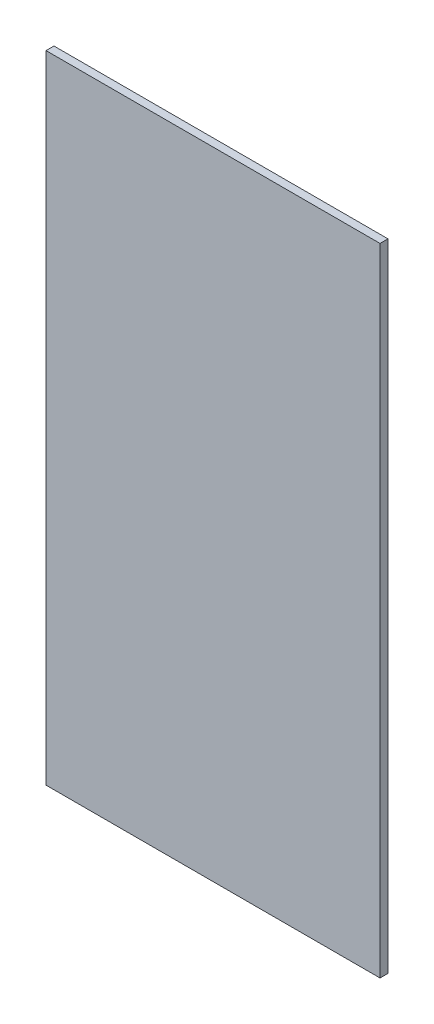
ISO-10303-21;
HEADER;
FILE_DESCRIPTION(('STEP AP214'),'2;1');
FILE_NAME('part.step','',(''),(''),'','','');
FILE_SCHEMA(('AUTOMOTIVE_DESIGN { 1 0 10303 214 1 1 1 1 }'));
ENDSEC;
DATA;
#1=APPLICATION_CONTEXT('core data for automotive mechanical design processes');
#2=APPLICATION_PROTOCOL_DEFINITION('international standard','automotive_design',2000,#1);
#3=PRODUCT_CONTEXT('',#1,'mechanical');
#4=PRODUCT('Part','Part','',(#3));
#5=PRODUCT_RELATED_PRODUCT_CATEGORY('part','',(#4));
#6=PRODUCT_DEFINITION_FORMATION('','',#4);
#7=PRODUCT_DEFINITION_CONTEXT('part definition',#1,'design');
#8=PRODUCT_DEFINITION('design','',#6,#7);
#9=PRODUCT_DEFINITION_SHAPE('','',#8);
#10=(LENGTH_UNIT() NAMED_UNIT(*) SI_UNIT(.MILLI.,.METRE.));
#11=(NAMED_UNIT(*) PLANE_ANGLE_UNIT() SI_UNIT($,.RADIAN.));
#12=(NAMED_UNIT(*) SI_UNIT($,.STERADIAN.) SOLID_ANGLE_UNIT());
#13=UNCERTAINTY_MEASURE_WITH_UNIT(LENGTH_MEASURE(1.E-05),#10,'distance_accuracy_value','');
#14=(GEOMETRIC_REPRESENTATION_CONTEXT(3) GLOBAL_UNCERTAINTY_ASSIGNED_CONTEXT((#13)) GLOBAL_UNIT_ASSIGNED_CONTEXT((#10,
#11,#12)) REPRESENTATION_CONTEXT('',''));
#15=CARTESIAN_POINT('',(0.,0.,0.));
#16=DIRECTION('',(0.,0.,1.));
#17=DIRECTION('',(1.,0.,0.));
#18=AXIS2_PLACEMENT_3D('',#15,#16,#17);
#19=CARTESIAN_POINT('',(1575.,3000.,75.));
#20=DIRECTION('',(-1.,0.,0.));
#21=DIRECTION('',(0.,-1.,0.));
#22=AXIS2_PLACEMENT_3D('',#19,#20,#21);
#23=PLANE('',#22);
#24=DIRECTION('',(0.,1.,0.));
#25=VECTOR('',#24,1.);
#26=CARTESIAN_POINT('',(1575.,3000.,0.));
#27=LINE('',#26,#25);
#28=CARTESIAN_POINT('',(1575.,-3000.,0.));
#29=VERTEX_POINT('',#28);
#30=CARTESIAN_POINT('',(1575.,3000.,0.));
#31=VERTEX_POINT('',#30);
#32=EDGE_CURVE('E115',#29,#31,#27,.T.);
#33=ORIENTED_EDGE('',*,*,#32,.T.);
#34=DIRECTION('',(0.,0.,-1.));
#35=VECTOR('',#34,1.);
#36=CARTESIAN_POINT('',(1575.,3000.,75.));
#37=LINE('',#36,#35);
#38=CARTESIAN_POINT('',(1575.,3000.,75.));
#39=VERTEX_POINT('',#38);
#40=EDGE_CURVE('E11',#39,#31,#37,.T.);
#41=ORIENTED_EDGE('',*,*,#40,.F.);
#42=DIRECTION('',(0.,1.,0.));
#43=VECTOR('',#42,1.);
#44=CARTESIAN_POINT('',(1575.,3000.,75.));
#45=LINE('',#44,#43);
#46=CARTESIAN_POINT('',(1575.,-3000.,75.));
#47=VERTEX_POINT('',#46);
#48=EDGE_CURVE('E99',#47,#39,#45,.T.);
#49=ORIENTED_EDGE('',*,*,#48,.F.);
#50=DIRECTION('',(0.,0.,-1.));
#51=VECTOR('',#50,1.);
#52=CARTESIAN_POINT('',(1575.,-3000.,75.));
#53=LINE('',#52,#51);
#54=EDGE_CURVE('E111',#47,#29,#53,.T.);
#55=ORIENTED_EDGE('',*,*,#54,.T.);
#56=EDGE_LOOP('',(#33,#41,#49,#55));
#57=FACE_BOUND('',#56,.T.);
#58=ADVANCED_FACE('F47',(#57),#23,.F.);
#59=CARTESIAN_POINT('',(-1575.,3000.,75.));
#60=DIRECTION('',(0.,-1.,0.));
#61=DIRECTION('',(0.,0.,-1.));
#62=AXIS2_PLACEMENT_3D('',#59,#60,#61);
#63=PLANE('',#62);
#64=DIRECTION('',(-1.,0.,0.));
#65=VECTOR('',#64,1.);
#66=CARTESIAN_POINT('',(-1575.,3000.,0.));
#67=LINE('',#66,#65);
#68=CARTESIAN_POINT('',(-1575.,3000.,0.));
#69=VERTEX_POINT('',#68);
#70=EDGE_CURVE('E104',#31,#69,#67,.T.);
#71=ORIENTED_EDGE('',*,*,#70,.T.);
#72=DIRECTION('',(0.,0.,-1.));
#73=VECTOR('',#72,1.);
#74=CARTESIAN_POINT('',(-1575.,3000.,75.));
#75=LINE('',#74,#73);
#76=CARTESIAN_POINT('',(-1575.,3000.,75.));
#77=VERTEX_POINT('',#76);
#78=EDGE_CURVE('E56',#77,#69,#75,.T.);
#79=ORIENTED_EDGE('',*,*,#78,.F.);
#80=DIRECTION('',(-1.,0.,0.));
#81=VECTOR('',#80,1.);
#82=CARTESIAN_POINT('',(-1575.,3000.,75.));
#83=LINE('',#82,#81);
#84=EDGE_CURVE('E94',#39,#77,#83,.T.);
#85=ORIENTED_EDGE('',*,*,#84,.F.);
#86=ORIENTED_EDGE('',*,*,#40,.T.);
#87=EDGE_LOOP('',(#71,#79,#85,#86));
#88=FACE_BOUND('',#87,.T.);
#89=ADVANCED_FACE('F103',(#88),#63,.F.);
#90=CARTESIAN_POINT('',(-1575.,3000.,75.));
#91=DIRECTION('',(1.,0.,0.));
#92=DIRECTION('',(0.,1.,0.));
#93=AXIS2_PLACEMENT_3D('',#90,#91,#92);
#94=PLANE('',#93);
#95=DIRECTION('',(0.,-1.,0.));
#96=VECTOR('',#95,1.);
#97=CARTESIAN_POINT('',(-1575.,3000.,0.));
#98=LINE('',#97,#96);
#99=CARTESIAN_POINT('',(-1575.,-3000.,0.));
#100=VERTEX_POINT('',#99);
#101=EDGE_CURVE('E81',#69,#100,#98,.T.);
#102=ORIENTED_EDGE('',*,*,#101,.T.);
#103=DIRECTION('',(0.,0.,-1.));
#104=VECTOR('',#103,1.);
#105=CARTESIAN_POINT('',(-1575.,-3000.,75.));
#106=LINE('',#105,#104);
#107=CARTESIAN_POINT('',(-1575.,-3000.,75.));
#108=VERTEX_POINT('',#107);
#109=EDGE_CURVE('E106',#108,#100,#106,.T.);
#110=ORIENTED_EDGE('',*,*,#109,.F.);
#111=DIRECTION('',(0.,-1.,0.));
#112=VECTOR('',#111,1.);
#113=CARTESIAN_POINT('',(-1575.,3000.,75.));
#114=LINE('',#113,#112);
#115=EDGE_CURVE('E97',#77,#108,#114,.T.);
#116=ORIENTED_EDGE('',*,*,#115,.F.);
#117=ORIENTED_EDGE('',*,*,#78,.T.);
#118=EDGE_LOOP('',(#102,#110,#116,#117));
#119=FACE_BOUND('',#118,.T.);
#120=ADVANCED_FACE('F107',(#119),#94,.F.);
#121=CARTESIAN_POINT('',(-1575.,-3000.,75.));
#122=DIRECTION('',(0.,1.,0.));
#123=DIRECTION('',(0.,0.,1.));
#124=AXIS2_PLACEMENT_3D('',#121,#122,#123);
#125=PLANE('',#124);
#126=DIRECTION('',(1.,0.,0.));
#127=VECTOR('',#126,1.);
#128=CARTESIAN_POINT('',(-1575.,-3000.,0.));
#129=LINE('',#128,#127);
#130=EDGE_CURVE('E87',#100,#29,#129,.T.);
#131=ORIENTED_EDGE('',*,*,#130,.T.);
#132=ORIENTED_EDGE('',*,*,#54,.F.);
#133=DIRECTION('',(1.,0.,0.));
#134=VECTOR('',#133,1.);
#135=CARTESIAN_POINT('',(-1575.,-3000.,75.));
#136=LINE('',#135,#134);
#137=EDGE_CURVE('E64',#108,#47,#136,.T.);
#138=ORIENTED_EDGE('',*,*,#137,.F.);
#139=ORIENTED_EDGE('',*,*,#109,.T.);
#140=EDGE_LOOP('',(#131,#132,#138,#139));
#141=FACE_BOUND('',#140,.T.);
#142=ADVANCED_FACE('F128',(#141),#125,.F.);
#143=CARTESIAN_POINT('',(0.,0.,75.));
#144=DIRECTION('',(0.,0.,1.));
#145=DIRECTION('',(1.,0.,0.));
#146=AXIS2_PLACEMENT_3D('',#143,#144,#145);
#147=PLANE('',#146);
#148=ORIENTED_EDGE('',*,*,#48,.T.);
#149=ORIENTED_EDGE('',*,*,#84,.T.);
#150=ORIENTED_EDGE('',*,*,#115,.T.);
#151=ORIENTED_EDGE('',*,*,#137,.T.);
#152=EDGE_LOOP('',(#148,#149,#150,#151));
#153=FACE_BOUND('',#152,.T.);
#154=ADVANCED_FACE('F95',(#153),#147,.T.);
#155=CARTESIAN_POINT('',(0.,0.,0.));
#156=DIRECTION('',(0.,0.,1.));
#157=DIRECTION('',(1.,0.,0.));
#158=AXIS2_PLACEMENT_3D('',#155,#156,#157);
#159=PLANE('',#158);
#160=ORIENTED_EDGE('',*,*,#32,.F.);
#161=ORIENTED_EDGE('',*,*,#130,.F.);
#162=ORIENTED_EDGE('',*,*,#101,.F.);
#163=ORIENTED_EDGE('',*,*,#70,.F.);
#164=EDGE_LOOP('',(#160,#161,#162,#163));
#165=FACE_BOUND('',#164,.T.);
#166=ADVANCED_FACE('F131',(#165),#159,.F.);
#167=CLOSED_SHELL('',(#58,#89,#120,#142,#154,#166));
#168=MANIFOLD_SOLID_BREP('B2',#167);
#169=ADVANCED_BREP_SHAPE_REPRESENTATION('',(#18,#168),#14);
#170=SHAPE_DEFINITION_REPRESENTATION(#9,#169);
ENDSEC;
END-ISO-10303-21;
